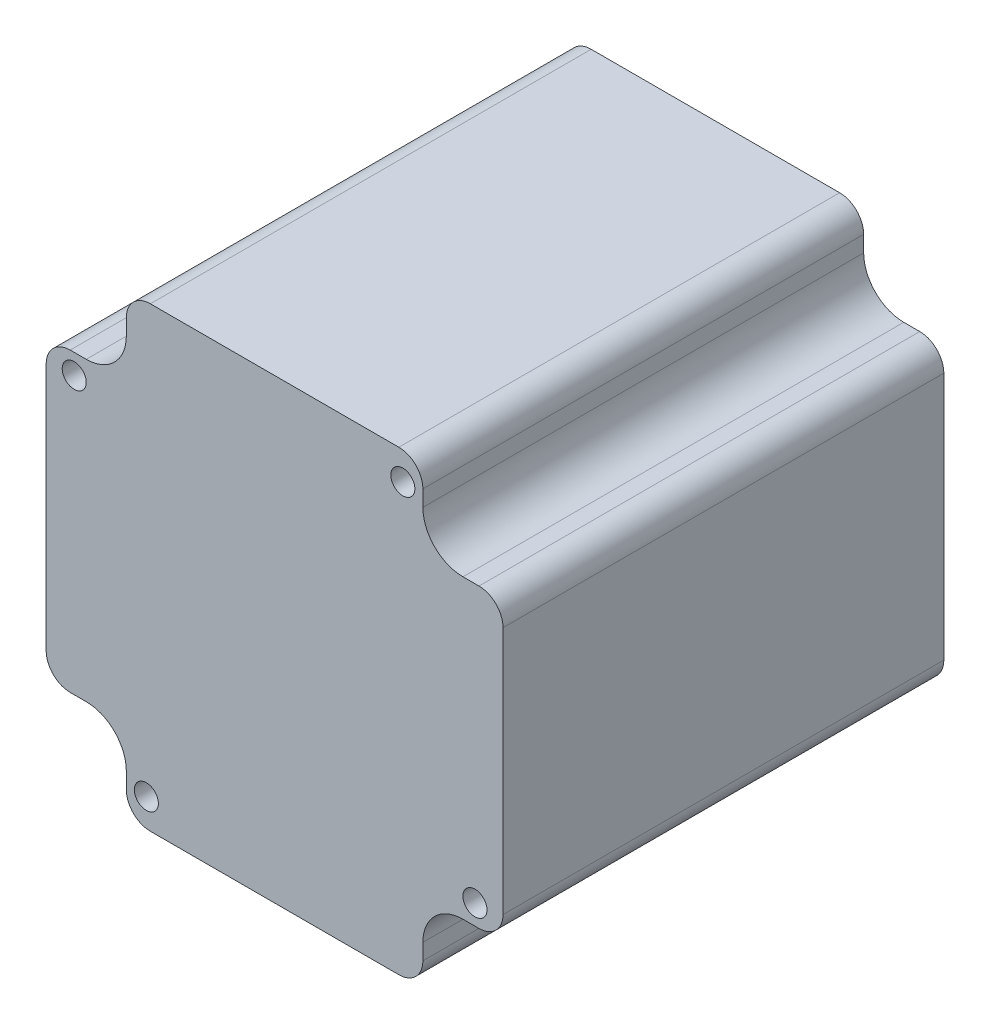
ISO-10303-21;
HEADER;
FILE_DESCRIPTION(('STEP AP214'),'2;1');
FILE_NAME('part.step','',(''),(''),'','','');
FILE_SCHEMA(('AUTOMOTIVE_DESIGN { 1 0 10303 214 1 1 1 1 }'));
ENDSEC;
DATA;
#1=APPLICATION_CONTEXT('core data for automotive mechanical design processes');
#2=APPLICATION_PROTOCOL_DEFINITION('international standard','automotive_design',2000,#1);
#3=PRODUCT_CONTEXT('',#1,'mechanical');
#4=PRODUCT('Part','Part','',(#3));
#5=PRODUCT_RELATED_PRODUCT_CATEGORY('part','',(#4));
#6=PRODUCT_DEFINITION_FORMATION('','',#4);
#7=PRODUCT_DEFINITION_CONTEXT('part definition',#1,'design');
#8=PRODUCT_DEFINITION('design','',#6,#7);
#9=PRODUCT_DEFINITION_SHAPE('','',#8);
#10=(LENGTH_UNIT() NAMED_UNIT(*) SI_UNIT(.MILLI.,.METRE.));
#11=(NAMED_UNIT(*) PLANE_ANGLE_UNIT() SI_UNIT($,.RADIAN.));
#12=(NAMED_UNIT(*) SI_UNIT($,.STERADIAN.) SOLID_ANGLE_UNIT());
#13=UNCERTAINTY_MEASURE_WITH_UNIT(LENGTH_MEASURE(1.E-05),#10,'distance_accuracy_value','');
#14=(GEOMETRIC_REPRESENTATION_CONTEXT(3) GLOBAL_UNCERTAINTY_ASSIGNED_CONTEXT((#13)) GLOBAL_UNIT_ASSIGNED_CONTEXT((#10,
#11,#12)) REPRESENTATION_CONTEXT('',''));
#15=CARTESIAN_POINT('',(0.,0.,0.));
#16=DIRECTION('',(0.,0.,1.));
#17=DIRECTION('',(1.,0.,0.));
#18=AXIS2_PLACEMENT_3D('',#15,#16,#17);
#19=CARTESIAN_POINT('',(-15.348869153361,-1.196280991736,-46.4999875));
#20=DIRECTION('',(0.,0.,-1.));
#21=DIRECTION('',(0.,1.,0.));
#22=AXIS2_PLACEMENT_3D('',#19,#20,#21);
#23=PLANE('',#22);
#24=CARTESIAN_POINT('',(33.151130846639,6.30371900826375,-46.4999875));
#25=DIRECTION('',(0.,0.,1.));
#26=DIRECTION('',(0.,-1.,0.));
#27=AXIS2_PLACEMENT_3D('',#24,#25,#26);
#28=CIRCLE('',#27,1.5);
#29=CARTESIAN_POINT('',(33.151130846639,4.80371900826375,-46.4999875));
#30=VERTEX_POINT('',#29);
#31=EDGE_CURVE('E385',#30,#30,#28,.T.);
#32=ORIENTED_EDGE('',*,*,#31,.T.);
#33=EDGE_LOOP('',(#32));
#34=FACE_BOUND('',#33,.T.);
#35=CARTESIAN_POINT('',(24.151130846639,47.303719008264,-46.4999875));
#36=DIRECTION('',(0.,0.,1.));
#37=DIRECTION('',(0.,-1.,0.));
#38=AXIS2_PLACEMENT_3D('',#35,#36,#37);
#39=CIRCLE('',#38,1.5);
#40=CARTESIAN_POINT('',(24.151130846639,45.803719008264,-46.4999875));
#41=VERTEX_POINT('',#40);
#42=EDGE_CURVE('E363',#41,#41,#39,.T.);
#43=ORIENTED_EDGE('',*,*,#42,.T.);
#44=EDGE_LOOP('',(#43));
#45=FACE_BOUND('',#44,.T.);
#46=CARTESIAN_POINT('',(-16.848869153361,38.303719008264,-46.4999875));
#47=DIRECTION('',(0.,0.,1.));
#48=DIRECTION('',(0.,-1.,0.));
#49=AXIS2_PLACEMENT_3D('',#46,#47,#48);
#50=CIRCLE('',#49,1.5);
#51=CARTESIAN_POINT('',(-16.848869153361,36.803719008264,-46.4999875));
#52=VERTEX_POINT('',#51);
#53=EDGE_CURVE('E318',#52,#52,#50,.T.);
#54=ORIENTED_EDGE('',*,*,#53,.T.);
#55=EDGE_LOOP('',(#54));
#56=FACE_BOUND('',#55,.T.);
#57=CARTESIAN_POINT('',(-7.848869153361,-2.696280991736,-46.4999875));
#58=DIRECTION('',(0.,0.,1.));
#59=DIRECTION('',(0.,-1.,0.));
#60=AXIS2_PLACEMENT_3D('',#57,#58,#59);
#61=CIRCLE('',#60,1.5);
#62=CARTESIAN_POINT('',(-7.848869153361,-4.196280991736,-46.4999875));
#63=VERTEX_POINT('',#62);
#64=EDGE_CURVE('E319',#63,#63,#61,.T.);
#65=ORIENTED_EDGE('',*,*,#64,.T.);
#66=EDGE_LOOP('',(#65));
#67=FACE_BOUND('',#66,.T.);
#68=CARTESIAN_POINT('',(-7.348869153361,-3.196280991736,-46.4999875));
#69=DIRECTION('',(0.,0.,1.));
#70=DIRECTION('',(0.,1.,0.));
#71=AXIS2_PLACEMENT_3D('',#68,#69,#70);
#72=CIRCLE('',#71,3.);
#73=CARTESIAN_POINT('',(-10.348869153361,-3.196280991736,-46.4999875));
#74=VERTEX_POINT('',#73);
#75=CARTESIAN_POINT('',(-7.348869153361,-6.196280991736,-46.4999875));
#76=VERTEX_POINT('',#75);
#77=EDGE_CURVE('E314',#74,#76,#72,.T.);
#78=ORIENTED_EDGE('',*,*,#77,.F.);
#79=DIRECTION('',(0.,1.,0.));
#80=VECTOR('',#79,1.);
#81=CARTESIAN_POINT('',(-10.348869153361,-1.196280991736,-46.4999875));
#82=LINE('',#81,#80);
#83=CARTESIAN_POINT('',(-10.348869153361,-1.196280991736,-46.4999875));
#84=VERTEX_POINT('',#83);
#85=EDGE_CURVE('E446',#74,#84,#82,.T.);
#86=ORIENTED_EDGE('',*,*,#85,.T.);
#87=CARTESIAN_POINT('',(-15.348869153361,-1.196280991736,-46.4999875));
#88=DIRECTION('',(0.,0.,1.));
#89=DIRECTION('',(0.,1.,0.));
#90=AXIS2_PLACEMENT_3D('',#87,#88,#89);
#91=CIRCLE('',#90,5.);
#92=CARTESIAN_POINT('',(-15.348869153361,3.803719008264,-46.4999875));
#93=VERTEX_POINT('',#92);
#94=EDGE_CURVE('E377',#84,#93,#91,.T.);
#95=ORIENTED_EDGE('',*,*,#94,.T.);
#96=DIRECTION('',(-1.,0.,0.));
#97=VECTOR('',#96,1.);
#98=CARTESIAN_POINT('',(-17.348869153361,3.803719008264,-46.4999875));
#99=LINE('',#98,#97);
#100=CARTESIAN_POINT('',(-17.348869153361,3.803719008264,-46.4999875));
#101=VERTEX_POINT('',#100);
#102=EDGE_CURVE('E11',#93,#101,#99,.T.);
#103=ORIENTED_EDGE('',*,*,#102,.T.);
#104=CARTESIAN_POINT('',(-17.348869153361,6.803719008264,-46.4999875));
#105=DIRECTION('',(0.,0.,1.));
#106=DIRECTION('',(0.,1.,0.));
#107=AXIS2_PLACEMENT_3D('',#104,#105,#106);
#108=CIRCLE('',#107,3.);
#109=CARTESIAN_POINT('',(-20.348869153361,6.803719008264,-46.4999875));
#110=VERTEX_POINT('',#109);
#111=EDGE_CURVE('E391',#110,#101,#108,.T.);
#112=ORIENTED_EDGE('',*,*,#111,.F.);
#113=DIRECTION('',(0.,1.,0.));
#114=VECTOR('',#113,1.);
#115=CARTESIAN_POINT('',(-20.348869153361,37.803719008264,-46.4999875));
#116=LINE('',#115,#114);
#117=CARTESIAN_POINT('',(-20.348869153361,37.803719008264,-46.4999875));
#118=VERTEX_POINT('',#117);
#119=EDGE_CURVE('E450',#110,#118,#116,.T.);
#120=ORIENTED_EDGE('',*,*,#119,.T.);
#121=CARTESIAN_POINT('',(-17.348869153361,37.803719008264,-46.4999875));
#122=DIRECTION('',(0.,0.,1.));
#123=DIRECTION('',(0.,1.,0.));
#124=AXIS2_PLACEMENT_3D('',#121,#122,#123);
#125=CIRCLE('',#124,3.);
#126=CARTESIAN_POINT('',(-17.348869153361,40.803719008264,-46.4999875));
#127=VERTEX_POINT('',#126);
#128=EDGE_CURVE('E421',#127,#118,#125,.T.);
#129=ORIENTED_EDGE('',*,*,#128,.F.);
#130=DIRECTION('',(1.,0.,0.));
#131=VECTOR('',#130,1.);
#132=CARTESIAN_POINT('',(-15.348869153361,40.803719008264,-46.4999875));
#133=LINE('',#132,#131);
#134=CARTESIAN_POINT('',(-15.348869153361,40.803719008264,-46.4999875));
#135=VERTEX_POINT('',#134);
#136=EDGE_CURVE('E442',#127,#135,#133,.T.);
#137=ORIENTED_EDGE('',*,*,#136,.T.);
#138=CARTESIAN_POINT('',(-15.348869153361,45.803719008264,-46.4999875));
#139=DIRECTION('',(0.,0.,1.));
#140=DIRECTION('',(0.,1.,0.));
#141=AXIS2_PLACEMENT_3D('',#138,#139,#140);
#142=CIRCLE('',#141,5.);
#143=CARTESIAN_POINT('',(-10.348869153361,45.803719008264,-46.4999875));
#144=VERTEX_POINT('',#143);
#145=EDGE_CURVE('E417',#135,#144,#142,.T.);
#146=ORIENTED_EDGE('',*,*,#145,.T.);
#147=DIRECTION('',(0.,1.,0.));
#148=VECTOR('',#147,1.);
#149=CARTESIAN_POINT('',(-10.348869153361,47.803719008264,-46.4999875));
#150=LINE('',#149,#148);
#151=CARTESIAN_POINT('',(-10.348869153361,47.803719008264,-46.4999875));
#152=VERTEX_POINT('',#151);
#153=EDGE_CURVE('E398',#144,#152,#150,.T.);
#154=ORIENTED_EDGE('',*,*,#153,.T.);
#155=CARTESIAN_POINT('',(-7.348869153361,47.803719008264,-46.4999875));
#156=DIRECTION('',(0.,0.,1.));
#157=DIRECTION('',(0.,1.,0.));
#158=AXIS2_PLACEMENT_3D('',#155,#156,#157);
#159=CIRCLE('',#158,3.);
#160=CARTESIAN_POINT('',(-7.348869153361,50.803719008264,-46.4999875));
#161=VERTEX_POINT('',#160);
#162=EDGE_CURVE('E334',#161,#152,#159,.T.);
#163=ORIENTED_EDGE('',*,*,#162,.F.);
#164=DIRECTION('',(1.,0.,0.));
#165=VECTOR('',#164,1.);
#166=CARTESIAN_POINT('',(23.651130846639,50.803719008264,-46.4999875));
#167=LINE('',#166,#165);
#168=CARTESIAN_POINT('',(23.651130846639,50.803719008264,-46.4999875));
#169=VERTEX_POINT('',#168);
#170=EDGE_CURVE('E331',#161,#169,#167,.T.);
#171=ORIENTED_EDGE('',*,*,#170,.T.);
#172=CARTESIAN_POINT('',(23.651130846639,47.803719008264,-46.4999875));
#173=DIRECTION('',(0.,0.,1.));
#174=DIRECTION('',(0.,1.,0.));
#175=AXIS2_PLACEMENT_3D('',#172,#173,#174);
#176=CIRCLE('',#175,3.);
#177=CARTESIAN_POINT('',(26.651130846639,47.803719008264,-46.4999875));
#178=VERTEX_POINT('',#177);
#179=EDGE_CURVE('E463',#178,#169,#176,.T.);
#180=ORIENTED_EDGE('',*,*,#179,.F.);
#181=DIRECTION('',(0.,-1.,0.));
#182=VECTOR('',#181,1.);
#183=CARTESIAN_POINT('',(26.651130846639,45.803719008264,-46.4999875));
#184=LINE('',#183,#182);
#185=CARTESIAN_POINT('',(26.651130846639,45.803719008264,-46.4999875));
#186=VERTEX_POINT('',#185);
#187=EDGE_CURVE('E439',#178,#186,#184,.T.);
#188=ORIENTED_EDGE('',*,*,#187,.T.);
#189=CARTESIAN_POINT('',(31.651130846639,45.803719008264,-46.4999875));
#190=DIRECTION('',(0.,0.,1.));
#191=DIRECTION('',(0.,1.,0.));
#192=AXIS2_PLACEMENT_3D('',#189,#190,#191);
#193=CIRCLE('',#192,5.);
#194=CARTESIAN_POINT('',(31.651130846639,40.803719008264,-46.4999875));
#195=VERTEX_POINT('',#194);
#196=EDGE_CURVE('E349',#186,#195,#193,.T.);
#197=ORIENTED_EDGE('',*,*,#196,.T.);
#198=DIRECTION('',(1.,0.,0.));
#199=VECTOR('',#198,1.);
#200=CARTESIAN_POINT('',(33.651130846639,40.803719008264,-46.4999875));
#201=LINE('',#200,#199);
#202=CARTESIAN_POINT('',(33.651130846639,40.803719008264,-46.4999875));
#203=VERTEX_POINT('',#202);
#204=EDGE_CURVE('E350',#195,#203,#201,.T.);
#205=ORIENTED_EDGE('',*,*,#204,.T.);
#206=CARTESIAN_POINT('',(33.651130846639,37.803719008264,-46.4999875));
#207=DIRECTION('',(0.,0.,1.));
#208=DIRECTION('',(0.,1.,0.));
#209=AXIS2_PLACEMENT_3D('',#206,#207,#208);
#210=CIRCLE('',#209,3.);
#211=CARTESIAN_POINT('',(36.651130846639,37.803719008264,-46.4999875));
#212=VERTEX_POINT('',#211);
#213=EDGE_CURVE('E376',#212,#203,#210,.T.);
#214=ORIENTED_EDGE('',*,*,#213,.F.);
#215=DIRECTION('',(0.,-1.,0.));
#216=VECTOR('',#215,1.);
#217=CARTESIAN_POINT('',(36.651130846639,6.803719008264,-46.4999875));
#218=LINE('',#217,#216);
#219=CARTESIAN_POINT('',(36.651130846639,6.803719008264,-46.4999875));
#220=VERTEX_POINT('',#219);
#221=EDGE_CURVE('E281',#212,#220,#218,.T.);
#222=ORIENTED_EDGE('',*,*,#221,.T.);
#223=CARTESIAN_POINT('',(33.651130846639,6.803719008264,-46.4999875));
#224=DIRECTION('',(0.,0.,1.));
#225=DIRECTION('',(0.,1.,0.));
#226=AXIS2_PLACEMENT_3D('',#223,#224,#225);
#227=CIRCLE('',#226,3.);
#228=CARTESIAN_POINT('',(33.651130846639,3.803719008264,-46.4999875));
#229=VERTEX_POINT('',#228);
#230=EDGE_CURVE('E412',#229,#220,#227,.T.);
#231=ORIENTED_EDGE('',*,*,#230,.F.);
#232=DIRECTION('',(-1.,0.,0.));
#233=VECTOR('',#232,1.);
#234=CARTESIAN_POINT('',(31.651130846639,3.803719008264,-46.4999875));
#235=LINE('',#234,#233);
#236=CARTESIAN_POINT('',(31.651130846639,3.803719008264,-46.4999875));
#237=VERTEX_POINT('',#236);
#238=EDGE_CURVE('E559',#229,#237,#235,.T.);
#239=ORIENTED_EDGE('',*,*,#238,.T.);
#240=CARTESIAN_POINT('',(31.651130846639,-1.196280991736,-46.4999875));
#241=DIRECTION('',(0.,0.,1.));
#242=DIRECTION('',(0.,1.,0.));
#243=AXIS2_PLACEMENT_3D('',#240,#241,#242);
#244=CIRCLE('',#243,5.);
#245=CARTESIAN_POINT('',(26.651130846639,-1.196280991736,-46.4999875));
#246=VERTEX_POINT('',#245);
#247=EDGE_CURVE('E514',#237,#246,#244,.T.);
#248=ORIENTED_EDGE('',*,*,#247,.T.);
#249=DIRECTION('',(0.,-1.,0.));
#250=VECTOR('',#249,1.);
#251=CARTESIAN_POINT('',(26.651130846639,-3.196280991736,-46.4999875));
#252=LINE('',#251,#250);
#253=CARTESIAN_POINT('',(26.651130846639,-3.196280991736,-46.4999875));
#254=VERTEX_POINT('',#253);
#255=EDGE_CURVE('E405',#246,#254,#252,.T.);
#256=ORIENTED_EDGE('',*,*,#255,.T.);
#257=CARTESIAN_POINT('',(23.651130846639,-3.196280991736,-46.4999875));
#258=DIRECTION('',(0.,0.,1.));
#259=DIRECTION('',(0.,1.,0.));
#260=AXIS2_PLACEMENT_3D('',#257,#258,#259);
#261=CIRCLE('',#260,3.);
#262=CARTESIAN_POINT('',(23.651130846639,-6.196280991736,-46.4999875));
#263=VERTEX_POINT('',#262);
#264=EDGE_CURVE('E357',#263,#254,#261,.T.);
#265=ORIENTED_EDGE('',*,*,#264,.F.);
#266=DIRECTION('',(-1.,0.,0.));
#267=VECTOR('',#266,1.);
#268=CARTESIAN_POINT('',(-7.348869153361,-6.196280991736,-46.4999875));
#269=LINE('',#268,#267);
#270=EDGE_CURVE('E362',#263,#76,#269,.T.);
#271=ORIENTED_EDGE('',*,*,#270,.T.);
#272=EDGE_LOOP('',(#78,#86,#95,#103,#112,#120,#129,#137,#146,#154,#163,#171,#180,#188,#197,#205,
#214,#222,#231,#239,#248,#256,#265,#271));
#273=FACE_BOUND('',#272,.T.);
#274=ADVANCED_FACE('F16',(#34,#45,#56,#67,#273),#23,.T.);
#275=CARTESIAN_POINT('',(-17.348869153361,3.803719008264,-16.4999875));
#276=DIRECTION('',(0.,1.,0.));
#277=DIRECTION('',(0.,0.,-1.));
#278=AXIS2_PLACEMENT_3D('',#275,#276,#277);
#279=PLANE('',#278);
#280=DIRECTION('',(0.,0.,1.));
#281=VECTOR('',#280,1.);
#282=CARTESIAN_POINT('',(-15.348869153361,3.803719008264,-16.4999875));
#283=LINE('',#282,#281);
#284=CARTESIAN_POINT('',(-15.348869153361,3.803719008264,8.5000125));
#285=VERTEX_POINT('',#284);
#286=EDGE_CURVE('E355',#93,#285,#283,.T.);
#287=ORIENTED_EDGE('',*,*,#286,.T.);
#288=DIRECTION('',(-1.,0.,0.));
#289=VECTOR('',#288,1.);
#290=CARTESIAN_POINT('',(-15.348869153361,3.803719008264,8.5000125));
#291=LINE('',#290,#289);
#292=CARTESIAN_POINT('',(-17.348869153361,3.803719008264,8.5000125));
#293=VERTEX_POINT('',#292);
#294=EDGE_CURVE('E425',#285,#293,#291,.T.);
#295=ORIENTED_EDGE('',*,*,#294,.T.);
#296=DIRECTION('',(0.,0.,1.));
#297=VECTOR('',#296,1.);
#298=CARTESIAN_POINT('',(-17.348869153361,3.803719008264,-16.4999875));
#299=LINE('',#298,#297);
#300=EDGE_CURVE('E27',#101,#293,#299,.T.);
#301=ORIENTED_EDGE('',*,*,#300,.F.);
#302=ORIENTED_EDGE('',*,*,#102,.F.);
#303=EDGE_LOOP('',(#287,#295,#301,#302));
#304=FACE_BOUND('',#303,.T.);
#305=ADVANCED_FACE('F604',(#304),#279,.F.);
#306=CARTESIAN_POINT('',(-17.348869153361,6.803719008264,-16.4999875));
#307=DIRECTION('',(0.,0.,-1.));
#308=DIRECTION('',(0.,1.,0.));
#309=AXIS2_PLACEMENT_3D('',#306,#307,#308);
#310=CYLINDRICAL_SURFACE('',#309,3.);
#311=CARTESIAN_POINT('',(-17.348869153361,6.803719008264,8.5000125));
#312=DIRECTION('',(0.,0.,-1.));
#313=DIRECTION('',(0.,1.,0.));
#314=AXIS2_PLACEMENT_3D('',#311,#312,#313);
#315=CIRCLE('',#314,3.);
#316=CARTESIAN_POINT('',(-20.348869153361,6.803719008264,8.5000125));
#317=VERTEX_POINT('',#316);
#318=EDGE_CURVE('E344',#293,#317,#315,.T.);
#319=ORIENTED_EDGE('',*,*,#318,.T.);
#320=DIRECTION('',(0.,0.,-1.));
#321=VECTOR('',#320,1.);
#322=CARTESIAN_POINT('',(-20.348869153361,6.803719008264,-16.4999875));
#323=LINE('',#322,#321);
#324=EDGE_CURVE('E420',#317,#110,#323,.T.);
#325=ORIENTED_EDGE('',*,*,#324,.T.);
#326=ORIENTED_EDGE('',*,*,#111,.T.);
#327=ORIENTED_EDGE('',*,*,#300,.T.);
#328=EDGE_LOOP('',(#319,#325,#326,#327));
#329=FACE_BOUND('',#328,.T.);
#330=ADVANCED_FACE('F607',(#329),#310,.T.);
#331=CARTESIAN_POINT('',(-20.348869153361,37.803719008264,-16.4999875));
#332=DIRECTION('',(1.,0.,0.));
#333=DIRECTION('',(0.,1.,0.));
#334=AXIS2_PLACEMENT_3D('',#331,#332,#333);
#335=PLANE('',#334);
#336=ORIENTED_EDGE('',*,*,#324,.F.);
#337=DIRECTION('',(0.,1.,0.));
#338=VECTOR('',#337,1.);
#339=CARTESIAN_POINT('',(-20.348869153361,-1.196280991736,8.5000125));
#340=LINE('',#339,#338);
#341=CARTESIAN_POINT('',(-20.348869153361,37.803719008264,8.5000125));
#342=VERTEX_POINT('',#341);
#343=EDGE_CURVE('E341',#317,#342,#340,.T.);
#344=ORIENTED_EDGE('',*,*,#343,.T.);
#345=DIRECTION('',(0.,0.,1.));
#346=VECTOR('',#345,1.);
#347=CARTESIAN_POINT('',(-20.348869153361,37.803719008264,-16.4999875));
#348=LINE('',#347,#346);
#349=EDGE_CURVE('E223',#118,#342,#348,.T.);
#350=ORIENTED_EDGE('',*,*,#349,.F.);
#351=ORIENTED_EDGE('',*,*,#119,.F.);
#352=EDGE_LOOP('',(#336,#344,#350,#351));
#353=FACE_BOUND('',#352,.T.);
#354=ADVANCED_FACE('F610',(#353),#335,.F.);
#355=CARTESIAN_POINT('',(-17.348869153361,37.803719008264,-16.4999875));
#356=DIRECTION('',(0.,0.,-1.));
#357=DIRECTION('',(0.,1.,0.));
#358=AXIS2_PLACEMENT_3D('',#355,#356,#357);
#359=CYLINDRICAL_SURFACE('',#358,3.);
#360=CARTESIAN_POINT('',(-17.348869153361,37.803719008264,8.5000125));
#361=DIRECTION('',(0.,0.,-1.));
#362=DIRECTION('',(0.,1.,0.));
#363=AXIS2_PLACEMENT_3D('',#360,#361,#362);
#364=CIRCLE('',#363,3.);
#365=CARTESIAN_POINT('',(-17.348869153361,40.803719008264,8.5000125));
#366=VERTEX_POINT('',#365);
#367=EDGE_CURVE('E339',#342,#366,#364,.T.);
#368=ORIENTED_EDGE('',*,*,#367,.T.);
#369=DIRECTION('',(0.,0.,-1.));
#370=VECTOR('',#369,1.);
#371=CARTESIAN_POINT('',(-17.348869153361,40.803719008264,-16.4999875));
#372=LINE('',#371,#370);
#373=EDGE_CURVE('E236',#366,#127,#372,.T.);
#374=ORIENTED_EDGE('',*,*,#373,.T.);
#375=ORIENTED_EDGE('',*,*,#128,.T.);
#376=ORIENTED_EDGE('',*,*,#349,.T.);
#377=EDGE_LOOP('',(#368,#374,#375,#376));
#378=FACE_BOUND('',#377,.T.);
#379=ADVANCED_FACE('F613',(#378),#359,.T.);
#380=CARTESIAN_POINT('',(-15.348869153361,40.803719008264,-16.4999875));
#381=DIRECTION('',(0.,-1.,0.));
#382=DIRECTION('',(1.,0.,0.));
#383=AXIS2_PLACEMENT_3D('',#380,#381,#382);
#384=PLANE('',#383);
#385=ORIENTED_EDGE('',*,*,#373,.F.);
#386=DIRECTION('',(1.,0.,0.));
#387=VECTOR('',#386,1.);
#388=CARTESIAN_POINT('',(-15.348869153361,40.803719008264,8.5000125));
#389=LINE('',#388,#387);
#390=CARTESIAN_POINT('',(-15.348869153361,40.803719008264,8.5000125));
#391=VERTEX_POINT('',#390);
#392=EDGE_CURVE('E336',#366,#391,#389,.T.);
#393=ORIENTED_EDGE('',*,*,#392,.T.);
#394=DIRECTION('',(0.,0.,-1.));
#395=VECTOR('',#394,1.);
#396=CARTESIAN_POINT('',(-15.348869153361,40.803719008264,-16.4999875));
#397=LINE('',#396,#395);
#398=EDGE_CURVE('E413',#391,#135,#397,.T.);
#399=ORIENTED_EDGE('',*,*,#398,.T.);
#400=ORIENTED_EDGE('',*,*,#136,.F.);
#401=EDGE_LOOP('',(#385,#393,#399,#400));
#402=FACE_BOUND('',#401,.T.);
#403=ADVANCED_FACE('F615',(#402),#384,.F.);
#404=CARTESIAN_POINT('',(-15.348869153361,45.803719008264,-16.4999875));
#405=DIRECTION('',(0.,0.,-1.));
#406=DIRECTION('',(0.,1.,0.));
#407=AXIS2_PLACEMENT_3D('',#404,#405,#406);
#408=CYLINDRICAL_SURFACE('',#407,5.);
#409=ORIENTED_EDGE('',*,*,#398,.F.);
#410=CARTESIAN_POINT('',(-15.348869153361,45.803719008264,8.5000125));
#411=DIRECTION('',(0.,0.,1.));
#412=DIRECTION('',(0.,1.,0.));
#413=AXIS2_PLACEMENT_3D('',#410,#411,#412);
#414=CIRCLE('',#413,5.);
#415=CARTESIAN_POINT('',(-10.348869153361,45.803719008264,8.5000125));
#416=VERTEX_POINT('',#415);
#417=EDGE_CURVE('E340',#391,#416,#414,.T.);
#418=ORIENTED_EDGE('',*,*,#417,.T.);
#419=DIRECTION('',(0.,0.,-1.));
#420=VECTOR('',#419,1.);
#421=CARTESIAN_POINT('',(-10.348869153361,45.803719008264,-16.4999875));
#422=LINE('',#421,#420);
#423=EDGE_CURVE('E395',#416,#144,#422,.T.);
#424=ORIENTED_EDGE('',*,*,#423,.T.);
#425=ORIENTED_EDGE('',*,*,#145,.F.);
#426=EDGE_LOOP('',(#409,#418,#424,#425));
#427=FACE_BOUND('',#426,.T.);
#428=ADVANCED_FACE('F619',(#427),#408,.F.);
#429=CARTESIAN_POINT('',(-10.348869153361,47.803719008264,-16.4999875));
#430=DIRECTION('',(1.,0.,0.));
#431=DIRECTION('',(0.,0.,1.));
#432=AXIS2_PLACEMENT_3D('',#429,#430,#431);
#433=PLANE('',#432);
#434=ORIENTED_EDGE('',*,*,#423,.F.);
#435=DIRECTION('',(0.,1.,0.));
#436=VECTOR('',#435,1.);
#437=CARTESIAN_POINT('',(-10.348869153361,-1.196280991736,8.5000125));
#438=LINE('',#437,#436);
#439=CARTESIAN_POINT('',(-10.348869153361,47.803719008264,8.5000125));
#440=VERTEX_POINT('',#439);
#441=EDGE_CURVE('E329',#416,#440,#438,.T.);
#442=ORIENTED_EDGE('',*,*,#441,.T.);
#443=DIRECTION('',(0.,0.,1.));
#444=VECTOR('',#443,1.);
#445=CARTESIAN_POINT('',(-10.348869153361,47.803719008264,-16.4999875));
#446=LINE('',#445,#444);
#447=EDGE_CURVE('E399',#152,#440,#446,.T.);
#448=ORIENTED_EDGE('',*,*,#447,.F.);
#449=ORIENTED_EDGE('',*,*,#153,.F.);
#450=EDGE_LOOP('',(#434,#442,#448,#449));
#451=FACE_BOUND('',#450,.T.);
#452=ADVANCED_FACE('F18',(#451),#433,.F.);
#453=CARTESIAN_POINT('',(-7.348869153361,47.803719008264,-16.4999875));
#454=DIRECTION('',(0.,0.,-1.));
#455=DIRECTION('',(0.,1.,0.));
#456=AXIS2_PLACEMENT_3D('',#453,#454,#455);
#457=CYLINDRICAL_SURFACE('',#456,3.);
#458=CARTESIAN_POINT('',(-7.348869153361,47.803719008264,8.5000125));
#459=DIRECTION('',(0.,0.,-1.));
#460=DIRECTION('',(0.,1.,0.));
#461=AXIS2_PLACEMENT_3D('',#458,#459,#460);
#462=CIRCLE('',#461,3.);
#463=CARTESIAN_POINT('',(-7.348869153361,50.803719008264,8.5000125));
#464=VERTEX_POINT('',#463);
#465=EDGE_CURVE('E325',#440,#464,#462,.T.);
#466=ORIENTED_EDGE('',*,*,#465,.T.);
#467=DIRECTION('',(0.,0.,-1.));
#468=VECTOR('',#467,1.);
#469=CARTESIAN_POINT('',(-7.348869153361,50.803719008264,-16.4999875));
#470=LINE('',#469,#468);
#471=EDGE_CURVE('E335',#464,#161,#470,.T.);
#472=ORIENTED_EDGE('',*,*,#471,.T.);
#473=ORIENTED_EDGE('',*,*,#162,.T.);
#474=ORIENTED_EDGE('',*,*,#447,.T.);
#475=EDGE_LOOP('',(#466,#472,#473,#474));
#476=FACE_BOUND('',#475,.T.);
#477=ADVANCED_FACE('F626',(#476),#457,.T.);
#478=CARTESIAN_POINT('',(23.651130846639,50.803719008264,-16.4999875));
#479=DIRECTION('',(0.,-1.,0.));
#480=DIRECTION('',(1.,0.,0.));
#481=AXIS2_PLACEMENT_3D('',#478,#479,#480);
#482=PLANE('',#481);
#483=ORIENTED_EDGE('',*,*,#471,.F.);
#484=DIRECTION('',(1.,0.,0.));
#485=VECTOR('',#484,1.);
#486=CARTESIAN_POINT('',(-15.348869153361,50.803719008264,8.5000125));
#487=LINE('',#486,#485);
#488=CARTESIAN_POINT('',(23.651130846639,50.803719008264,8.5000125));
#489=VERTEX_POINT('',#488);
#490=EDGE_CURVE('E330',#464,#489,#487,.T.);
#491=ORIENTED_EDGE('',*,*,#490,.T.);
#492=DIRECTION('',(0.,0.,1.));
#493=VECTOR('',#492,1.);
#494=CARTESIAN_POINT('',(23.651130846639,50.803719008264,-16.4999875));
#495=LINE('',#494,#493);
#496=EDGE_CURVE('E460',#169,#489,#495,.T.);
#497=ORIENTED_EDGE('',*,*,#496,.F.);
#498=ORIENTED_EDGE('',*,*,#170,.F.);
#499=EDGE_LOOP('',(#483,#491,#497,#498));
#500=FACE_BOUND('',#499,.T.);
#501=ADVANCED_FACE('F630',(#500),#482,.F.);
#502=CARTESIAN_POINT('',(23.651130846639,47.803719008264,-16.4999875));
#503=DIRECTION('',(0.,0.,-1.));
#504=DIRECTION('',(0.,1.,0.));
#505=AXIS2_PLACEMENT_3D('',#502,#503,#504);
#506=CYLINDRICAL_SURFACE('',#505,3.);
#507=CARTESIAN_POINT('',(23.651130846639,47.803719008264,8.5000125));
#508=DIRECTION('',(0.,0.,-1.));
#509=DIRECTION('',(0.,1.,0.));
#510=AXIS2_PLACEMENT_3D('',#507,#508,#509);
#511=CIRCLE('',#510,3.);
#512=CARTESIAN_POINT('',(26.651130846639,47.803719008264,8.5000125));
#513=VERTEX_POINT('',#512);
#514=EDGE_CURVE('E455',#489,#513,#511,.T.);
#515=ORIENTED_EDGE('',*,*,#514,.T.);
#516=DIRECTION('',(0.,0.,-1.));
#517=VECTOR('',#516,1.);
#518=CARTESIAN_POINT('',(26.651130846639,47.803719008264,-16.4999875));
#519=LINE('',#518,#517);
#520=EDGE_CURVE('E388',#513,#178,#519,.T.);
#521=ORIENTED_EDGE('',*,*,#520,.T.);
#522=ORIENTED_EDGE('',*,*,#179,.T.);
#523=ORIENTED_EDGE('',*,*,#496,.T.);
#524=EDGE_LOOP('',(#515,#521,#522,#523));
#525=FACE_BOUND('',#524,.T.);
#526=ADVANCED_FACE('F634',(#525),#506,.T.);
#527=CARTESIAN_POINT('',(26.651130846639,45.803719008264,-16.4999875));
#528=DIRECTION('',(-1.,0.,0.));
#529=DIRECTION('',(0.,-1.,0.));
#530=AXIS2_PLACEMENT_3D('',#527,#528,#529);
#531=PLANE('',#530);
#532=ORIENTED_EDGE('',*,*,#520,.F.);
#533=DIRECTION('',(0.,-1.,0.));
#534=VECTOR('',#533,1.);
#535=CARTESIAN_POINT('',(26.651130846639,-1.196280991736,8.5000125));
#536=LINE('',#535,#534);
#537=CARTESIAN_POINT('',(26.651130846639,45.803719008264,8.5000125));
#538=VERTEX_POINT('',#537);
#539=EDGE_CURVE('E451',#513,#538,#536,.T.);
#540=ORIENTED_EDGE('',*,*,#539,.T.);
#541=DIRECTION('',(0.,0.,-1.));
#542=VECTOR('',#541,1.);
#543=CARTESIAN_POINT('',(26.651130846639,45.803719008264,-16.4999875));
#544=LINE('',#543,#542);
#545=EDGE_CURVE('E345',#538,#186,#544,.T.);
#546=ORIENTED_EDGE('',*,*,#545,.T.);
#547=ORIENTED_EDGE('',*,*,#187,.F.);
#548=EDGE_LOOP('',(#532,#540,#546,#547));
#549=FACE_BOUND('',#548,.T.);
#550=ADVANCED_FACE('F638',(#549),#531,.F.);
#551=CARTESIAN_POINT('',(31.651130846639,45.803719008264,-16.4999875));
#552=DIRECTION('',(0.,0.,-1.));
#553=DIRECTION('',(0.,1.,0.));
#554=AXIS2_PLACEMENT_3D('',#551,#552,#553);
#555=CYLINDRICAL_SURFACE('',#554,5.);
#556=ORIENTED_EDGE('',*,*,#545,.F.);
#557=CARTESIAN_POINT('',(31.651130846639,45.803719008264,8.5000125));
#558=DIRECTION('',(0.,0.,1.));
#559=DIRECTION('',(0.,1.,0.));
#560=AXIS2_PLACEMENT_3D('',#557,#558,#559);
#561=CIRCLE('',#560,5.);
#562=CARTESIAN_POINT('',(31.651130846639,40.803719008264,8.5000125));
#563=VERTEX_POINT('',#562);
#564=EDGE_CURVE('E394',#538,#563,#561,.T.);
#565=ORIENTED_EDGE('',*,*,#564,.T.);
#566=DIRECTION('',(0.,0.,-1.));
#567=VECTOR('',#566,1.);
#568=CARTESIAN_POINT('',(31.651130846639,40.803719008264,-16.4999875));
#569=LINE('',#568,#567);
#570=EDGE_CURVE('E375',#563,#195,#569,.T.);
#571=ORIENTED_EDGE('',*,*,#570,.T.);
#572=ORIENTED_EDGE('',*,*,#196,.F.);
#573=EDGE_LOOP('',(#556,#565,#571,#572));
#574=FACE_BOUND('',#573,.T.);
#575=ADVANCED_FACE('F642',(#574),#555,.F.);
#576=CARTESIAN_POINT('',(33.651130846639,40.803719008264,-16.4999875));
#577=DIRECTION('',(0.,-1.,0.));
#578=DIRECTION('',(1.,0.,0.));
#579=AXIS2_PLACEMENT_3D('',#576,#577,#578);
#580=PLANE('',#579);
#581=ORIENTED_EDGE('',*,*,#570,.F.);
#582=DIRECTION('',(1.,0.,0.));
#583=VECTOR('',#582,1.);
#584=CARTESIAN_POINT('',(-15.348869153361,40.803719008264,8.5000125));
#585=LINE('',#584,#583);
#586=CARTESIAN_POINT('',(33.651130846639,40.803719008264,8.5000125));
#587=VERTEX_POINT('',#586);
#588=EDGE_CURVE('E296',#563,#587,#585,.T.);
#589=ORIENTED_EDGE('',*,*,#588,.T.);
#590=DIRECTION('',(0.,0.,1.));
#591=VECTOR('',#590,1.);
#592=CARTESIAN_POINT('',(33.651130846639,40.803719008264,-16.4999875));
#593=LINE('',#592,#591);
#594=EDGE_CURVE('E291',#203,#587,#593,.T.);
#595=ORIENTED_EDGE('',*,*,#594,.F.);
#596=ORIENTED_EDGE('',*,*,#204,.F.);
#597=EDGE_LOOP('',(#581,#589,#595,#596));
#598=FACE_BOUND('',#597,.T.);
#599=ADVANCED_FACE('F645',(#598),#580,.F.);
#600=CARTESIAN_POINT('',(33.651130846639,37.803719008264,-16.4999875));
#601=DIRECTION('',(0.,0.,-1.));
#602=DIRECTION('',(0.,1.,0.));
#603=AXIS2_PLACEMENT_3D('',#600,#601,#602);
#604=CYLINDRICAL_SURFACE('',#603,3.);
#605=CARTESIAN_POINT('',(33.651130846639,37.803719008264,8.5000125));
#606=DIRECTION('',(0.,0.,-1.));
#607=DIRECTION('',(0.,1.,0.));
#608=AXIS2_PLACEMENT_3D('',#605,#606,#607);
#609=CIRCLE('',#608,3.);
#610=CARTESIAN_POINT('',(36.651130846639,37.803719008264,8.5000125));
#611=VERTEX_POINT('',#610);
#612=EDGE_CURVE('E288',#587,#611,#609,.T.);
#613=ORIENTED_EDGE('',*,*,#612,.T.);
#614=DIRECTION('',(0.,0.,-1.));
#615=VECTOR('',#614,1.);
#616=CARTESIAN_POINT('',(36.651130846639,37.803719008264,-16.4999875));
#617=LINE('',#616,#615);
#618=EDGE_CURVE('E274',#611,#212,#617,.T.);
#619=ORIENTED_EDGE('',*,*,#618,.T.);
#620=ORIENTED_EDGE('',*,*,#213,.T.);
#621=ORIENTED_EDGE('',*,*,#594,.T.);
#622=EDGE_LOOP('',(#613,#619,#620,#621));
#623=FACE_BOUND('',#622,.T.);
#624=ADVANCED_FACE('F289',(#623),#604,.T.);
#625=CARTESIAN_POINT('',(36.651130846639,6.803719008264,-16.4999875));
#626=DIRECTION('',(-1.,0.,0.));
#627=DIRECTION('',(0.,0.,1.));
#628=AXIS2_PLACEMENT_3D('',#625,#626,#627);
#629=PLANE('',#628);
#630=ORIENTED_EDGE('',*,*,#618,.F.);
#631=DIRECTION('',(0.,-1.,0.));
#632=VECTOR('',#631,1.);
#633=CARTESIAN_POINT('',(36.651130846639,-1.196280991736,8.5000125));
#634=LINE('',#633,#632);
#635=CARTESIAN_POINT('',(36.651130846639,6.803719008264,8.5000125));
#636=VERTEX_POINT('',#635);
#637=EDGE_CURVE('E279',#611,#636,#634,.T.);
#638=ORIENTED_EDGE('',*,*,#637,.T.);
#639=DIRECTION('',(0.,0.,1.));
#640=VECTOR('',#639,1.);
#641=CARTESIAN_POINT('',(36.651130846639,6.803719008264,-16.4999875));
#642=LINE('',#641,#640);
#643=EDGE_CURVE('E285',#220,#636,#642,.T.);
#644=ORIENTED_EDGE('',*,*,#643,.F.);
#645=ORIENTED_EDGE('',*,*,#221,.F.);
#646=EDGE_LOOP('',(#630,#638,#644,#645));
#647=FACE_BOUND('',#646,.T.);
#648=ADVANCED_FACE('F276',(#647),#629,.F.);
#649=CARTESIAN_POINT('',(33.651130846639,6.803719008264,-16.4999875));
#650=DIRECTION('',(0.,0.,-1.));
#651=DIRECTION('',(0.,1.,0.));
#652=AXIS2_PLACEMENT_3D('',#649,#650,#651);
#653=CYLINDRICAL_SURFACE('',#652,3.);
#654=CARTESIAN_POINT('',(33.651130846639,6.803719008264,8.5000125));
#655=DIRECTION('',(0.,0.,-1.));
#656=DIRECTION('',(0.,1.,0.));
#657=AXIS2_PLACEMENT_3D('',#654,#655,#656);
#658=CIRCLE('',#657,3.);
#659=CARTESIAN_POINT('',(33.651130846639,3.803719008264,8.5000125));
#660=VERTEX_POINT('',#659);
#661=EDGE_CURVE('E302',#636,#660,#658,.T.);
#662=ORIENTED_EDGE('',*,*,#661,.T.);
#663=DIRECTION('',(0.,0.,-1.));
#664=VECTOR('',#663,1.);
#665=CARTESIAN_POINT('',(33.651130846639,3.803719008264,-16.4999875));
#666=LINE('',#665,#664);
#667=EDGE_CURVE('E564',#660,#229,#666,.T.);
#668=ORIENTED_EDGE('',*,*,#667,.T.);
#669=ORIENTED_EDGE('',*,*,#230,.T.);
#670=ORIENTED_EDGE('',*,*,#643,.T.);
#671=EDGE_LOOP('',(#662,#668,#669,#670));
#672=FACE_BOUND('',#671,.T.);
#673=ADVANCED_FACE('F648',(#672),#653,.T.);
#674=CARTESIAN_POINT('',(31.651130846639,3.803719008264,-16.4999875));
#675=DIRECTION('',(0.,1.,0.));
#676=DIRECTION('',(0.,0.,-1.));
#677=AXIS2_PLACEMENT_3D('',#674,#675,#676);
#678=PLANE('',#677);
#679=ORIENTED_EDGE('',*,*,#667,.F.);
#680=DIRECTION('',(-1.,0.,0.));
#681=VECTOR('',#680,1.);
#682=CARTESIAN_POINT('',(-15.348869153361,3.803719008264,8.5000125));
#683=LINE('',#682,#681);
#684=CARTESIAN_POINT('',(31.651130846639,3.803719008264,8.5000125));
#685=VERTEX_POINT('',#684);
#686=EDGE_CURVE('E310',#660,#685,#683,.T.);
#687=ORIENTED_EDGE('',*,*,#686,.T.);
#688=DIRECTION('',(0.,0.,-1.));
#689=VECTOR('',#688,1.);
#690=CARTESIAN_POINT('',(31.651130846639,3.803719008264,-16.4999875));
#691=LINE('',#690,#689);
#692=EDGE_CURVE('E510',#685,#237,#691,.T.);
#693=ORIENTED_EDGE('',*,*,#692,.T.);
#694=ORIENTED_EDGE('',*,*,#238,.F.);
#695=EDGE_LOOP('',(#679,#687,#693,#694));
#696=FACE_BOUND('',#695,.T.);
#697=ADVANCED_FACE('F650',(#696),#678,.F.);
#698=CARTESIAN_POINT('',(31.651130846639,-1.196280991736,-16.4999875));
#699=DIRECTION('',(0.,0.,-1.));
#700=DIRECTION('',(0.,1.,0.));
#701=AXIS2_PLACEMENT_3D('',#698,#699,#700);
#702=CYLINDRICAL_SURFACE('',#701,5.);
#703=ORIENTED_EDGE('',*,*,#692,.F.);
#704=CARTESIAN_POINT('',(31.651130846639,-1.196280991736,8.5000125));
#705=DIRECTION('',(0.,0.,1.));
#706=DIRECTION('',(0.,1.,0.));
#707=AXIS2_PLACEMENT_3D('',#704,#705,#706);
#708=CIRCLE('',#707,5.);
#709=CARTESIAN_POINT('',(26.651130846639,-1.196280991736,8.5000125));
#710=VERTEX_POINT('',#709);
#711=EDGE_CURVE('E320',#685,#710,#708,.T.);
#712=ORIENTED_EDGE('',*,*,#711,.T.);
#713=DIRECTION('',(0.,0.,-1.));
#714=VECTOR('',#713,1.);
#715=CARTESIAN_POINT('',(26.651130846639,-1.196280991736,-16.4999875));
#716=LINE('',#715,#714);
#717=EDGE_CURVE('E401',#710,#246,#716,.T.);
#718=ORIENTED_EDGE('',*,*,#717,.T.);
#719=ORIENTED_EDGE('',*,*,#247,.F.);
#720=EDGE_LOOP('',(#703,#712,#718,#719));
#721=FACE_BOUND('',#720,.T.);
#722=ADVANCED_FACE('F582',(#721),#702,.F.);
#723=CARTESIAN_POINT('',(26.651130846639,-3.196280991736,-16.4999875));
#724=DIRECTION('',(-1.,0.,0.));
#725=DIRECTION('',(0.,-1.,0.));
#726=AXIS2_PLACEMENT_3D('',#723,#724,#725);
#727=PLANE('',#726);
#728=ORIENTED_EDGE('',*,*,#717,.F.);
#729=DIRECTION('',(0.,-1.,0.));
#730=VECTOR('',#729,1.);
#731=CARTESIAN_POINT('',(26.651130846639,-1.196280991736,8.5000125));
#732=LINE('',#731,#730);
#733=CARTESIAN_POINT('',(26.651130846639,-3.196280991736,8.5000125));
#734=VERTEX_POINT('',#733);
#735=EDGE_CURVE('E324',#710,#734,#732,.T.);
#736=ORIENTED_EDGE('',*,*,#735,.T.);
#737=DIRECTION('',(0.,0.,1.));
#738=VECTOR('',#737,1.);
#739=CARTESIAN_POINT('',(26.651130846639,-3.196280991736,-16.4999875));
#740=LINE('',#739,#738);
#741=EDGE_CURVE('E361',#254,#734,#740,.T.);
#742=ORIENTED_EDGE('',*,*,#741,.F.);
#743=ORIENTED_EDGE('',*,*,#255,.F.);
#744=EDGE_LOOP('',(#728,#736,#742,#743));
#745=FACE_BOUND('',#744,.T.);
#746=ADVANCED_FACE('F579',(#745),#727,.F.);
#747=CARTESIAN_POINT('',(23.651130846639,-3.196280991736,-16.4999875));
#748=DIRECTION('',(0.,0.,-1.));
#749=DIRECTION('',(0.,1.,0.));
#750=AXIS2_PLACEMENT_3D('',#747,#748,#749);
#751=CYLINDRICAL_SURFACE('',#750,3.);
#752=CARTESIAN_POINT('',(23.651130846639,-3.196280991736,8.5000125));
#753=DIRECTION('',(0.,0.,-1.));
#754=DIRECTION('',(0.,1.,0.));
#755=AXIS2_PLACEMENT_3D('',#752,#753,#754);
#756=CIRCLE('',#755,3.);
#757=CARTESIAN_POINT('',(23.651130846639,-6.196280991736,8.5000125));
#758=VERTEX_POINT('',#757);
#759=EDGE_CURVE('E20',#734,#758,#756,.T.);
#760=ORIENTED_EDGE('',*,*,#759,.T.);
#761=DIRECTION('',(0.,0.,-1.));
#762=VECTOR('',#761,1.);
#763=CARTESIAN_POINT('',(23.651130846639,-6.196280991736,-16.4999875));
#764=LINE('',#763,#762);
#765=EDGE_CURVE('E368',#758,#263,#764,.T.);
#766=ORIENTED_EDGE('',*,*,#765,.T.);
#767=ORIENTED_EDGE('',*,*,#264,.T.);
#768=ORIENTED_EDGE('',*,*,#741,.T.);
#769=EDGE_LOOP('',(#760,#766,#767,#768));
#770=FACE_BOUND('',#769,.T.);
#771=ADVANCED_FACE('F577',(#770),#751,.T.);
#772=CARTESIAN_POINT('',(-7.348869153361,-6.196280991736,-16.4999875));
#773=DIRECTION('',(0.,1.,0.));
#774=DIRECTION('',(0.,0.,-1.));
#775=AXIS2_PLACEMENT_3D('',#772,#773,#774);
#776=PLANE('',#775);
#777=ORIENTED_EDGE('',*,*,#765,.F.);
#778=DIRECTION('',(-1.,0.,0.));
#779=VECTOR('',#778,1.);
#780=CARTESIAN_POINT('',(-15.348869153361,-6.196280991736,8.5000125));
#781=LINE('',#780,#779);
#782=CARTESIAN_POINT('',(-7.348869153361,-6.196280991736,8.5000125));
#783=VERTEX_POINT('',#782);
#784=EDGE_CURVE('E485',#758,#783,#781,.T.);
#785=ORIENTED_EDGE('',*,*,#784,.T.);
#786=DIRECTION('',(0.,0.,1.));
#787=VECTOR('',#786,1.);
#788=CARTESIAN_POINT('',(-7.348869153361,-6.196280991736,-16.4999875));
#789=LINE('',#788,#787);
#790=EDGE_CURVE('E372',#76,#783,#789,.T.);
#791=ORIENTED_EDGE('',*,*,#790,.F.);
#792=ORIENTED_EDGE('',*,*,#270,.F.);
#793=EDGE_LOOP('',(#777,#785,#791,#792));
#794=FACE_BOUND('',#793,.T.);
#795=ADVANCED_FACE('F588',(#794),#776,.F.);
#796=CARTESIAN_POINT('',(-7.348869153361,-3.196280991736,-16.4999875));
#797=DIRECTION('',(0.,0.,-1.));
#798=DIRECTION('',(0.,1.,0.));
#799=AXIS2_PLACEMENT_3D('',#796,#797,#798);
#800=CYLINDRICAL_SURFACE('',#799,3.);
#801=CARTESIAN_POINT('',(-7.348869153361,-3.196280991736,8.5000125));
#802=DIRECTION('',(0.,0.,-1.));
#803=DIRECTION('',(0.,1.,0.));
#804=AXIS2_PLACEMENT_3D('',#801,#802,#803);
#805=CIRCLE('',#804,3.);
#806=CARTESIAN_POINT('',(-10.348869153361,-3.196280991736,8.5000125));
#807=VERTEX_POINT('',#806);
#808=EDGE_CURVE('E493',#783,#807,#805,.T.);
#809=ORIENTED_EDGE('',*,*,#808,.T.);
#810=DIRECTION('',(0.,0.,-1.));
#811=VECTOR('',#810,1.);
#812=CARTESIAN_POINT('',(-10.348869153361,-3.196280991736,-16.4999875));
#813=LINE('',#812,#811);
#814=EDGE_CURVE('E380',#807,#74,#813,.T.);
#815=ORIENTED_EDGE('',*,*,#814,.T.);
#816=ORIENTED_EDGE('',*,*,#77,.T.);
#817=ORIENTED_EDGE('',*,*,#790,.T.);
#818=EDGE_LOOP('',(#809,#815,#816,#817));
#819=FACE_BOUND('',#818,.T.);
#820=ADVANCED_FACE('F596',(#819),#800,.T.);
#821=CARTESIAN_POINT('',(-10.348869153361,-1.196280991736,-16.4999875));
#822=DIRECTION('',(1.,0.,0.));
#823=DIRECTION('',(0.,0.,1.));
#824=AXIS2_PLACEMENT_3D('',#821,#822,#823);
#825=PLANE('',#824);
#826=ORIENTED_EDGE('',*,*,#814,.F.);
#827=DIRECTION('',(0.,1.,0.));
#828=VECTOR('',#827,1.);
#829=CARTESIAN_POINT('',(-10.348869153361,-1.196280991736,8.5000125));
#830=LINE('',#829,#828);
#831=CARTESIAN_POINT('',(-10.348869153361,-1.196280991736,8.5000125));
#832=VERTEX_POINT('',#831);
#833=EDGE_CURVE('E384',#807,#832,#830,.T.);
#834=ORIENTED_EDGE('',*,*,#833,.T.);
#835=DIRECTION('',(0.,0.,-1.));
#836=VECTOR('',#835,1.);
#837=CARTESIAN_POINT('',(-10.348869153361,-1.196280991736,-16.4999875));
#838=LINE('',#837,#836);
#839=EDGE_CURVE('E351',#832,#84,#838,.T.);
#840=ORIENTED_EDGE('',*,*,#839,.T.);
#841=ORIENTED_EDGE('',*,*,#85,.F.);
#842=EDGE_LOOP('',(#826,#834,#840,#841));
#843=FACE_BOUND('',#842,.T.);
#844=ADVANCED_FACE('F595',(#843),#825,.F.);
#845=CARTESIAN_POINT('',(-15.348869153361,-1.196280991736,-16.4999875));
#846=DIRECTION('',(0.,0.,-1.));
#847=DIRECTION('',(0.,1.,0.));
#848=AXIS2_PLACEMENT_3D('',#845,#846,#847);
#849=CYLINDRICAL_SURFACE('',#848,5.);
#850=ORIENTED_EDGE('',*,*,#839,.F.);
#851=CARTESIAN_POINT('',(-15.348869153361,-1.196280991736,8.5000125));
#852=DIRECTION('',(0.,0.,1.));
#853=DIRECTION('',(0.,1.,0.));
#854=AXIS2_PLACEMENT_3D('',#851,#852,#853);
#855=CIRCLE('',#854,5.);
#856=EDGE_CURVE('E356',#832,#285,#855,.T.);
#857=ORIENTED_EDGE('',*,*,#856,.T.);
#858=ORIENTED_EDGE('',*,*,#286,.F.);
#859=ORIENTED_EDGE('',*,*,#94,.F.);
#860=EDGE_LOOP('',(#850,#857,#858,#859));
#861=FACE_BOUND('',#860,.T.);
#862=ADVANCED_FACE('F602',(#861),#849,.F.);
#863=CARTESIAN_POINT('',(-15.348869153361,-1.196280991736,8.5000125));
#864=DIRECTION('',(0.,0.,-1.));
#865=DIRECTION('',(0.,1.,0.));
#866=AXIS2_PLACEMENT_3D('',#863,#864,#865);
#867=PLANE('',#866);
#868=CARTESIAN_POINT('',(33.151130846639,6.30371900826375,8.5000125));
#869=DIRECTION('',(0.,0.,1.));
#870=DIRECTION('',(0.,-1.,0.));
#871=AXIS2_PLACEMENT_3D('',#868,#869,#870);
#872=CIRCLE('',#871,1.5);
#873=CARTESIAN_POINT('',(33.151130846639,4.80371900826375,8.5000125));
#874=VERTEX_POINT('',#873);
#875=EDGE_CURVE('E381',#874,#874,#872,.T.);
#876=ORIENTED_EDGE('',*,*,#875,.F.);
#877=EDGE_LOOP('',(#876));
#878=FACE_BOUND('',#877,.T.);
#879=CARTESIAN_POINT('',(24.151130846639,47.303719008264,8.5000125));
#880=DIRECTION('',(0.,0.,1.));
#881=DIRECTION('',(0.,-1.,0.));
#882=AXIS2_PLACEMENT_3D('',#879,#880,#881);
#883=CIRCLE('',#882,1.5);
#884=CARTESIAN_POINT('',(24.151130846639,45.803719008264,8.5000125));
#885=VERTEX_POINT('',#884);
#886=EDGE_CURVE('E366',#885,#885,#883,.T.);
#887=ORIENTED_EDGE('',*,*,#886,.F.);
#888=EDGE_LOOP('',(#887));
#889=FACE_BOUND('',#888,.T.);
#890=CARTESIAN_POINT('',(-16.848869153361,38.303719008264,8.5000125));
#891=DIRECTION('',(0.,0.,1.));
#892=DIRECTION('',(0.,-1.,0.));
#893=AXIS2_PLACEMENT_3D('',#890,#891,#892);
#894=CIRCLE('',#893,1.5);
#895=CARTESIAN_POINT('',(-16.848869153361,36.803719008264,8.5000125));
#896=VERTEX_POINT('',#895);
#897=EDGE_CURVE('E367',#896,#896,#894,.T.);
#898=ORIENTED_EDGE('',*,*,#897,.F.);
#899=EDGE_LOOP('',(#898));
#900=FACE_BOUND('',#899,.T.);
#901=CARTESIAN_POINT('',(-7.848869153361,-2.696280991736,8.5000125));
#902=DIRECTION('',(0.,0.,1.));
#903=DIRECTION('',(0.,-1.,0.));
#904=AXIS2_PLACEMENT_3D('',#901,#902,#903);
#905=CIRCLE('',#904,1.5);
#906=CARTESIAN_POINT('',(-7.848869153361,-4.196280991736,8.5000125));
#907=VERTEX_POINT('',#906);
#908=EDGE_CURVE('E316',#907,#907,#905,.T.);
#909=ORIENTED_EDGE('',*,*,#908,.F.);
#910=EDGE_LOOP('',(#909));
#911=FACE_BOUND('',#910,.T.);
#912=ORIENTED_EDGE('',*,*,#833,.F.);
#913=ORIENTED_EDGE('',*,*,#808,.F.);
#914=ORIENTED_EDGE('',*,*,#784,.F.);
#915=ORIENTED_EDGE('',*,*,#759,.F.);
#916=ORIENTED_EDGE('',*,*,#735,.F.);
#917=ORIENTED_EDGE('',*,*,#711,.F.);
#918=ORIENTED_EDGE('',*,*,#686,.F.);
#919=ORIENTED_EDGE('',*,*,#661,.F.);
#920=ORIENTED_EDGE('',*,*,#637,.F.);
#921=ORIENTED_EDGE('',*,*,#612,.F.);
#922=ORIENTED_EDGE('',*,*,#588,.F.);
#923=ORIENTED_EDGE('',*,*,#564,.F.);
#924=ORIENTED_EDGE('',*,*,#539,.F.);
#925=ORIENTED_EDGE('',*,*,#514,.F.);
#926=ORIENTED_EDGE('',*,*,#490,.F.);
#927=ORIENTED_EDGE('',*,*,#465,.F.);
#928=ORIENTED_EDGE('',*,*,#441,.F.);
#929=ORIENTED_EDGE('',*,*,#417,.F.);
#930=ORIENTED_EDGE('',*,*,#392,.F.);
#931=ORIENTED_EDGE('',*,*,#367,.F.);
#932=ORIENTED_EDGE('',*,*,#343,.F.);
#933=ORIENTED_EDGE('',*,*,#318,.F.);
#934=ORIENTED_EDGE('',*,*,#294,.F.);
#935=ORIENTED_EDGE('',*,*,#856,.F.);
#936=EDGE_LOOP('',(#912,#913,#914,#915,#916,#917,#918,#919,#920,#921,#922,#923,#924,#925,#926,
#927,#928,#929,#930,#931,#932,#933,#934,#935));
#937=FACE_BOUND('',#936,.T.);
#938=ADVANCED_FACE('F299',(#878,#889,#900,#911,#937),#867,.F.);
#939=CARTESIAN_POINT('',(33.151130846639,6.30371900826375,-46.4999875));
#940=DIRECTION('',(0.,0.,1.));
#941=DIRECTION('',(0.,-1.,0.));
#942=AXIS2_PLACEMENT_3D('',#939,#940,#941);
#943=CYLINDRICAL_SURFACE('',#942,1.5);
#944=ORIENTED_EDGE('',*,*,#875,.T.);
#945=EDGE_LOOP('',(#944));
#946=FACE_BOUND('',#945,.T.);
#947=ORIENTED_EDGE('',*,*,#31,.F.);
#948=EDGE_LOOP('',(#947));
#949=FACE_BOUND('',#948,.T.);
#950=ADVANCED_FACE('F694',(#946,#949),#943,.F.);
#951=CARTESIAN_POINT('',(24.151130846639,47.303719008264,-46.4999875));
#952=DIRECTION('',(0.,0.,1.));
#953=DIRECTION('',(0.,-1.,0.));
#954=AXIS2_PLACEMENT_3D('',#951,#952,#953);
#955=CYLINDRICAL_SURFACE('',#954,1.5);
#956=ORIENTED_EDGE('',*,*,#886,.T.);
#957=EDGE_LOOP('',(#956));
#958=FACE_BOUND('',#957,.T.);
#959=ORIENTED_EDGE('',*,*,#42,.F.);
#960=EDGE_LOOP('',(#959));
#961=FACE_BOUND('',#960,.T.);
#962=ADVANCED_FACE('F712',(#958,#961),#955,.F.);
#963=CARTESIAN_POINT('',(-16.848869153361,38.303719008264,-46.4999875));
#964=DIRECTION('',(0.,0.,1.));
#965=DIRECTION('',(0.,-1.,0.));
#966=AXIS2_PLACEMENT_3D('',#963,#964,#965);
#967=CYLINDRICAL_SURFACE('',#966,1.5);
#968=ORIENTED_EDGE('',*,*,#897,.T.);
#969=EDGE_LOOP('',(#968));
#970=FACE_BOUND('',#969,.T.);
#971=ORIENTED_EDGE('',*,*,#53,.F.);
#972=EDGE_LOOP('',(#971));
#973=FACE_BOUND('',#972,.T.);
#974=ADVANCED_FACE('F686',(#970,#973),#967,.F.);
#975=CARTESIAN_POINT('',(-7.848869153361,-2.696280991736,-46.4999875));
#976=DIRECTION('',(0.,0.,1.));
#977=DIRECTION('',(0.,-1.,0.));
#978=AXIS2_PLACEMENT_3D('',#975,#976,#977);
#979=CYLINDRICAL_SURFACE('',#978,1.5);
#980=ORIENTED_EDGE('',*,*,#908,.T.);
#981=EDGE_LOOP('',(#980));
#982=FACE_BOUND('',#981,.T.);
#983=ORIENTED_EDGE('',*,*,#64,.F.);
#984=EDGE_LOOP('',(#983));
#985=FACE_BOUND('',#984,.T.);
#986=ADVANCED_FACE('F683',(#982,#985),#979,.F.);
#987=CLOSED_SHELL('',(#274,#305,#330,#354,#379,#403,#428,#452,#477,#501,#526,#550,#575,#599,
#624,#648,#673,#697,#722,#746,#771,#795,#820,#844,#862,#938,#950,#962,#974,#986));
#988=MANIFOLD_SOLID_BREP('B1',#987);
#989=ADVANCED_BREP_SHAPE_REPRESENTATION('',(#18,#988),#14);
#990=SHAPE_DEFINITION_REPRESENTATION(#9,#989);
ENDSEC;
END-ISO-10303-21;
